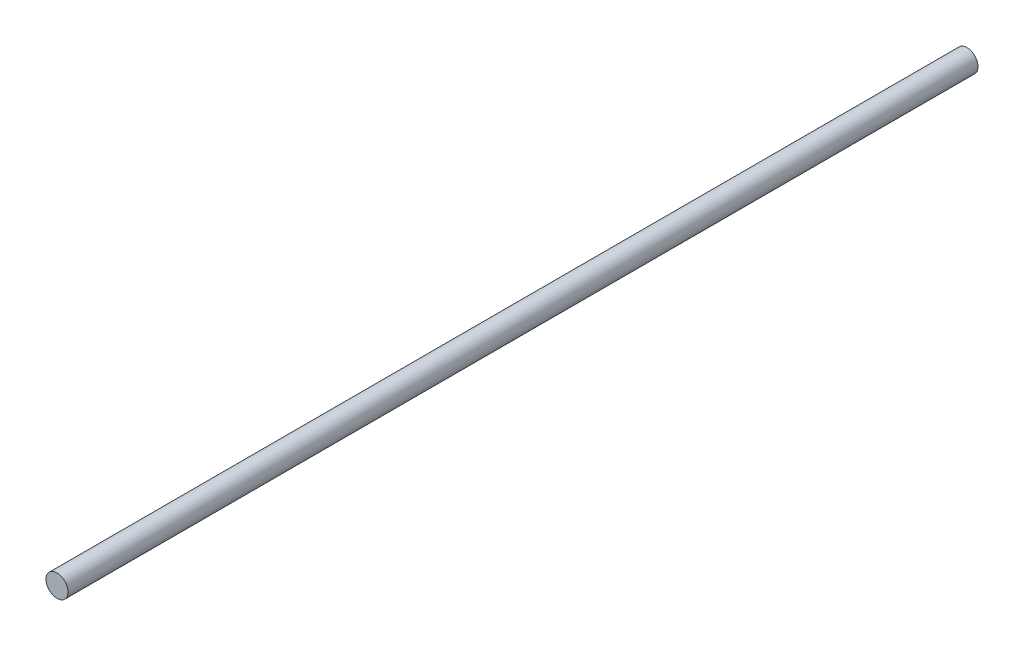
ISO-10303-21;
HEADER;
FILE_DESCRIPTION(('STEP AP214'),'2;1');
FILE_NAME('part.step','',(''),(''),'','','');
FILE_SCHEMA(('AUTOMOTIVE_DESIGN { 1 0 10303 214 1 1 1 1 }'));
ENDSEC;
DATA;
#1=APPLICATION_CONTEXT('core data for automotive mechanical design processes');
#2=APPLICATION_PROTOCOL_DEFINITION('international standard','automotive_design',2000,#1);
#3=PRODUCT_CONTEXT('',#1,'mechanical');
#4=PRODUCT('Part','Part','',(#3));
#5=PRODUCT_RELATED_PRODUCT_CATEGORY('part','',(#4));
#6=PRODUCT_DEFINITION_FORMATION('','',#4);
#7=PRODUCT_DEFINITION_CONTEXT('part definition',#1,'design');
#8=PRODUCT_DEFINITION('design','',#6,#7);
#9=PRODUCT_DEFINITION_SHAPE('','',#8);
#10=(LENGTH_UNIT() NAMED_UNIT(*) SI_UNIT(.MILLI.,.METRE.));
#11=(NAMED_UNIT(*) PLANE_ANGLE_UNIT() SI_UNIT($,.RADIAN.));
#12=(NAMED_UNIT(*) SI_UNIT($,.STERADIAN.) SOLID_ANGLE_UNIT());
#13=UNCERTAINTY_MEASURE_WITH_UNIT(LENGTH_MEASURE(1.E-05),#10,'distance_accuracy_value','');
#14=(GEOMETRIC_REPRESENTATION_CONTEXT(3) GLOBAL_UNCERTAINTY_ASSIGNED_CONTEXT((#13)) GLOBAL_UNIT_ASSIGNED_CONTEXT((#10,
#11,#12)) REPRESENTATION_CONTEXT('',''));
#15=CARTESIAN_POINT('',(0.,0.,0.));
#16=DIRECTION('',(0.,0.,1.));
#17=DIRECTION('',(1.,0.,0.));
#18=AXIS2_PLACEMENT_3D('',#15,#16,#17);
#19=CARTESIAN_POINT('',(0.,0.,-330.));
#20=DIRECTION('',(0.,0.,1.));
#21=DIRECTION('',(1.,0.,0.));
#22=AXIS2_PLACEMENT_3D('',#19,#20,#21);
#23=CYLINDRICAL_SURFACE('',#22,4.);
#24=CARTESIAN_POINT('',(0.,0.,-330.));
#25=DIRECTION('',(0.,0.,1.));
#26=DIRECTION('',(1.,0.,0.));
#27=AXIS2_PLACEMENT_3D('',#24,#25,#26);
#28=CIRCLE('',#27,4.);
#29=CARTESIAN_POINT('',(4.,0.,-330.));
#30=VERTEX_POINT('',#29);
#31=EDGE_CURVE('E10',#30,#30,#28,.T.);
#32=ORIENTED_EDGE('',*,*,#31,.T.);
#33=EDGE_LOOP('',(#32));
#34=FACE_BOUND('',#33,.T.);
#35=CARTESIAN_POINT('',(0.,0.,0.));
#36=DIRECTION('',(0.,0.,1.));
#37=DIRECTION('',(1.,0.,0.));
#38=AXIS2_PLACEMENT_3D('',#35,#36,#37);
#39=CIRCLE('',#38,4.);
#40=CARTESIAN_POINT('',(4.,0.,0.));
#41=VERTEX_POINT('',#40);
#42=EDGE_CURVE('E40',#41,#41,#39,.T.);
#43=ORIENTED_EDGE('',*,*,#42,.F.);
#44=EDGE_LOOP('',(#43));
#45=FACE_BOUND('',#44,.T.);
#46=ADVANCED_FACE('F37',(#34,#45),#23,.T.);
#47=CARTESIAN_POINT('',(0.,0.,-330.));
#48=DIRECTION('',(0.,0.,1.));
#49=DIRECTION('',(1.,0.,0.));
#50=AXIS2_PLACEMENT_3D('',#47,#48,#49);
#51=PLANE('',#50);
#52=ORIENTED_EDGE('',*,*,#31,.F.);
#53=EDGE_LOOP('',(#52));
#54=FACE_BOUND('',#53,.T.);
#55=ADVANCED_FACE('F54',(#54),#51,.F.);
#56=CARTESIAN_POINT('',(0.,0.,0.));
#57=DIRECTION('',(0.,0.,1.));
#58=DIRECTION('',(1.,0.,0.));
#59=AXIS2_PLACEMENT_3D('',#56,#57,#58);
#60=PLANE('',#59);
#61=ORIENTED_EDGE('',*,*,#42,.T.);
#62=EDGE_LOOP('',(#61));
#63=FACE_BOUND('',#62,.T.);
#64=ADVANCED_FACE('F51',(#63),#60,.T.);
#65=CLOSED_SHELL('',(#46,#55,#64));
#66=MANIFOLD_SOLID_BREP('B2',#65);
#67=ADVANCED_BREP_SHAPE_REPRESENTATION('',(#18,#66),#14);
#68=SHAPE_DEFINITION_REPRESENTATION(#9,#67);
ENDSEC;
END-ISO-10303-21;
